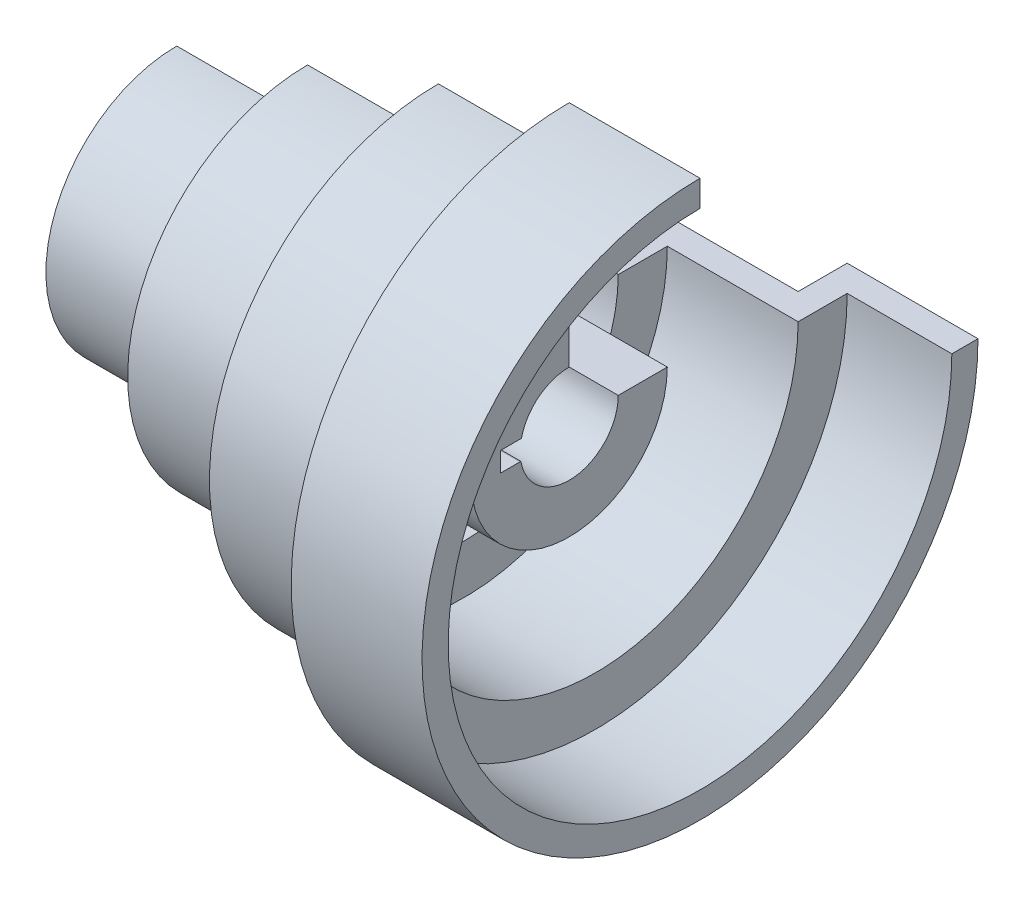
ISO-10303-21;
HEADER;
FILE_DESCRIPTION(('STEP AP214'),'2;1');
FILE_NAME('part.step','',(''),(''),'','','');
FILE_SCHEMA(('AUTOMOTIVE_DESIGN { 1 0 10303 214 1 1 1 1 }'));
ENDSEC;
DATA;
#1=APPLICATION_CONTEXT('core data for automotive mechanical design processes');
#2=APPLICATION_PROTOCOL_DEFINITION('international standard','automotive_design',2000,#1);
#3=PRODUCT_CONTEXT('',#1,'mechanical');
#4=PRODUCT('Part','Part','',(#3));
#5=PRODUCT_RELATED_PRODUCT_CATEGORY('part','',(#4));
#6=PRODUCT_DEFINITION_FORMATION('','',#4);
#7=PRODUCT_DEFINITION_CONTEXT('part definition',#1,'design');
#8=PRODUCT_DEFINITION('design','',#6,#7);
#9=PRODUCT_DEFINITION_SHAPE('','',#8);
#10=(LENGTH_UNIT() NAMED_UNIT(*) SI_UNIT(.MILLI.,.METRE.));
#11=(NAMED_UNIT(*) PLANE_ANGLE_UNIT() SI_UNIT($,.RADIAN.));
#12=(NAMED_UNIT(*) SI_UNIT($,.STERADIAN.) SOLID_ANGLE_UNIT());
#13=UNCERTAINTY_MEASURE_WITH_UNIT(LENGTH_MEASURE(1.E-05),#10,'distance_accuracy_value','');
#14=(GEOMETRIC_REPRESENTATION_CONTEXT(3) GLOBAL_UNCERTAINTY_ASSIGNED_CONTEXT((#13)) GLOBAL_UNIT_ASSIGNED_CONTEXT((#10,
#11,#12)) REPRESENTATION_CONTEXT('',''));
#15=CARTESIAN_POINT('',(0.,0.,0.));
#16=DIRECTION('',(0.,0.,1.));
#17=DIRECTION('',(1.,0.,0.));
#18=AXIS2_PLACEMENT_3D('',#15,#16,#17);
#19=CARTESIAN_POINT('',(-141.986286210627,1.57116660247941E-13,-15.));
#20=DIRECTION('',(1.,0.,0.));
#21=DIRECTION('',(0.,0.,-1.));
#22=AXIS2_PLACEMENT_3D('',#19,#20,#21);
#23=PLANE('',#22);
#24=DIRECTION('',(0.,0.,1.));
#25=VECTOR('',#24,1.);
#26=CARTESIAN_POINT('',(-141.986286210627,-2.59126506949967,15.));
#27=LINE('',#26,#25);
#28=CARTESIAN_POINT('',(-141.986286210627,-2.59126506949967,14.7744829127652));
#29=VERTEX_POINT('',#28);
#30=CARTESIAN_POINT('',(-141.986286210627,-2.59126506949967,15.));
#31=VERTEX_POINT('',#30);
#32=EDGE_CURVE('E207',#29,#31,#27,.T.);
#33=ORIENTED_EDGE('',*,*,#32,.F.);
#34=CARTESIAN_POINT('',(-141.986286210627,0.,0.));
#35=DIRECTION('',(-1.,0.,0.));
#36=DIRECTION('',(0.,0.,1.));
#37=AXIS2_PLACEMENT_3D('',#34,#35,#36);
#38=CIRCLE('',#37,15.);
#39=CARTESIAN_POINT('',(-141.986286210627,1.57116660247941E-13,-15.));
#40=VERTEX_POINT('',#39);
#41=EDGE_CURVE('E399',#40,#29,#38,.T.);
#42=ORIENTED_EDGE('',*,*,#41,.F.);
#43=DIRECTION('',(0.,0.,1.));
#44=VECTOR('',#43,1.);
#45=CARTESIAN_POINT('',(-141.986286210627,1.57116660247941E-13,-15.));
#46=LINE('',#45,#44);
#47=CARTESIAN_POINT('',(-141.986286210627,4.18977760661176E-13,-40.));
#48=VERTEX_POINT('',#47);
#49=EDGE_CURVE('E327',#48,#40,#46,.T.);
#50=ORIENTED_EDGE('',*,*,#49,.F.);
#51=CARTESIAN_POINT('',(-141.986286210627,0.,0.));
#52=DIRECTION('',(-1.,0.,0.));
#53=DIRECTION('',(0.,0.,1.));
#54=AXIS2_PLACEMENT_3D('',#51,#52,#53);
#55=CIRCLE('',#54,40.);
#56=CARTESIAN_POINT('',(-141.986286210627,40.,0.));
#57=VERTEX_POINT('',#56);
#58=EDGE_CURVE('E69',#48,#57,#55,.T.);
#59=ORIENTED_EDGE('',*,*,#58,.T.);
#60=DIRECTION('',(0.,-1.,0.));
#61=VECTOR('',#60,1.);
#62=CARTESIAN_POINT('',(-141.986286210627,15.,0.));
#63=LINE('',#62,#61);
#64=CARTESIAN_POINT('',(-141.986286210627,15.,0.));
#65=VERTEX_POINT('',#64);
#66=EDGE_CURVE('E256',#57,#65,#63,.T.);
#67=ORIENTED_EDGE('',*,*,#66,.T.);
#68=CARTESIAN_POINT('',(-141.986286210627,3.40873493050033,14.607550313916));
#69=VERTEX_POINT('',#68);
#70=EDGE_CURVE('E398',#69,#65,#38,.T.);
#71=ORIENTED_EDGE('',*,*,#70,.F.);
#72=DIRECTION('',(0.,0.,-1.));
#73=VECTOR('',#72,1.);
#74=CARTESIAN_POINT('',(-141.986286210627,3.40873493050033,15.));
#75=LINE('',#74,#73);
#76=CARTESIAN_POINT('',(-141.986286210627,3.40873493050033,15.));
#77=VERTEX_POINT('',#76);
#78=EDGE_CURVE('E238',#77,#69,#75,.T.);
#79=ORIENTED_EDGE('',*,*,#78,.F.);
#80=DIRECTION('',(0.,0.,-1.));
#81=VECTOR('',#80,1.);
#82=CARTESIAN_POINT('',(-141.986286210627,3.40873493050033,15.));
#83=LINE('',#82,#81);
#84=CARTESIAN_POINT('',(-141.986286210627,3.40873493050033,21.));
#85=VERTEX_POINT('',#84);
#86=EDGE_CURVE('E232',#85,#77,#83,.T.);
#87=ORIENTED_EDGE('',*,*,#86,.F.);
#88=DIRECTION('',(0.,1.,0.));
#89=VECTOR('',#88,1.);
#90=CARTESIAN_POINT('',(-141.986286210627,3.40873493050033,21.));
#91=LINE('',#90,#89);
#92=CARTESIAN_POINT('',(-141.986286210627,-2.59126506949967,21.));
#93=VERTEX_POINT('',#92);
#94=EDGE_CURVE('E228',#93,#85,#91,.T.);
#95=ORIENTED_EDGE('',*,*,#94,.F.);
#96=DIRECTION('',(0.,0.,1.));
#97=VECTOR('',#96,1.);
#98=CARTESIAN_POINT('',(-141.986286210627,-2.59126506949967,15.));
#99=LINE('',#98,#97);
#100=EDGE_CURVE('E216',#31,#93,#99,.T.);
#101=ORIENTED_EDGE('',*,*,#100,.F.);
#102=EDGE_LOOP('',(#33,#42,#50,#59,#67,#71,#79,#87,#95,#101));
#103=FACE_BOUND('',#102,.T.);
#104=ADVANCED_FACE('F45',(#103),#23,.F.);
#105=CARTESIAN_POINT('',(-141.986286210627,0.,0.));
#106=DIRECTION('',(-1.,0.,0.));
#107=DIRECTION('',(0.,0.,1.));
#108=AXIS2_PLACEMENT_3D('',#105,#106,#107);
#109=CYLINDRICAL_SURFACE('',#108,15.);
#110=DIRECTION('',(1.,0.,0.));
#111=VECTOR('',#110,1.);
#112=CARTESIAN_POINT('',(-502.974513165468,3.40873493050033,14.607550313916));
#113=LINE('',#112,#111);
#114=CARTESIAN_POINT('',(-21.9862862106269,3.40873493050033,14.607550313916));
#115=VERTEX_POINT('',#114);
#116=EDGE_CURVE('E241',#69,#115,#113,.T.);
#117=ORIENTED_EDGE('',*,*,#116,.F.);
#118=ORIENTED_EDGE('',*,*,#70,.T.);
#119=DIRECTION('',(1.,0.,0.));
#120=VECTOR('',#119,1.);
#121=CARTESIAN_POINT('',(-141.986286210627,15.,0.));
#122=LINE('',#121,#120);
#123=CARTESIAN_POINT('',(-21.9862862106269,15.,0.));
#124=VERTEX_POINT('',#123);
#125=EDGE_CURVE('E260',#65,#124,#122,.T.);
#126=ORIENTED_EDGE('',*,*,#125,.T.);
#127=CARTESIAN_POINT('',(-21.9862862106269,0.,0.));
#128=DIRECTION('',(-1.,0.,0.));
#129=DIRECTION('',(0.,0.,1.));
#130=AXIS2_PLACEMENT_3D('',#127,#128,#129);
#131=CIRCLE('',#130,15.);
#132=EDGE_CURVE('E402',#115,#124,#131,.T.);
#133=ORIENTED_EDGE('',*,*,#132,.F.);
#134=EDGE_LOOP('',(#117,#118,#126,#133));
#135=FACE_BOUND('',#134,.T.);
#136=ADVANCED_FACE('F477',(#135),#109,.F.);
#137=CARTESIAN_POINT('',(-141.986286210627,0.,0.));
#138=DIRECTION('',(-1.,0.,0.));
#139=DIRECTION('',(0.,0.,1.));
#140=AXIS2_PLACEMENT_3D('',#137,#138,#139);
#141=CYLINDRICAL_SURFACE('',#140,40.);
#142=CARTESIAN_POINT('',(-101.986286210627,0.,0.));
#143=DIRECTION('',(-1.,0.,0.));
#144=DIRECTION('',(0.,0.,1.));
#145=AXIS2_PLACEMENT_3D('',#142,#143,#144);
#146=CIRCLE('',#145,40.);
#147=CARTESIAN_POINT('',(-101.986286210627,4.18977760661176E-13,-40.));
#148=VERTEX_POINT('',#147);
#149=CARTESIAN_POINT('',(-101.986286210627,40.,0.));
#150=VERTEX_POINT('',#149);
#151=EDGE_CURVE('E449',#148,#150,#146,.T.);
#152=ORIENTED_EDGE('',*,*,#151,.T.);
#153=DIRECTION('',(-1.,0.,0.));
#154=VECTOR('',#153,1.);
#155=CARTESIAN_POINT('',(-141.986286210627,40.,0.));
#156=LINE('',#155,#154);
#157=EDGE_CURVE('E324',#150,#57,#156,.T.);
#158=ORIENTED_EDGE('',*,*,#157,.T.);
#159=ORIENTED_EDGE('',*,*,#58,.F.);
#160=DIRECTION('',(-1.,0.,0.));
#161=VECTOR('',#160,1.);
#162=CARTESIAN_POINT('',(-141.986286210627,4.18977760661176E-13,-40.));
#163=LINE('',#162,#161);
#164=EDGE_CURVE('E395',#148,#48,#163,.T.);
#165=ORIENTED_EDGE('',*,*,#164,.F.);
#166=EDGE_LOOP('',(#152,#158,#159,#165));
#167=FACE_BOUND('',#166,.T.);
#168=ADVANCED_FACE('F47',(#167),#141,.T.);
#169=CARTESIAN_POINT('',(-101.986286210627,5.76094420909117E-13,-55.));
#170=DIRECTION('',(1.,0.,0.));
#171=DIRECTION('',(0.,0.,-1.));
#172=AXIS2_PLACEMENT_3D('',#169,#170,#171);
#173=PLANE('',#172);
#174=CARTESIAN_POINT('',(-101.986286210627,0.,0.));
#175=DIRECTION('',(-1.,0.,0.));
#176=DIRECTION('',(0.,0.,1.));
#177=AXIS2_PLACEMENT_3D('',#174,#175,#176);
#178=CIRCLE('',#177,55.);
#179=CARTESIAN_POINT('',(-101.986286210627,5.76094420909117E-13,-55.));
#180=VERTEX_POINT('',#179);
#181=CARTESIAN_POINT('',(-101.986286210627,55.,0.));
#182=VERTEX_POINT('',#181);
#183=EDGE_CURVE('E446',#180,#182,#178,.T.);
#184=ORIENTED_EDGE('',*,*,#183,.T.);
#185=DIRECTION('',(0.,-1.,0.));
#186=VECTOR('',#185,1.);
#187=CARTESIAN_POINT('',(-101.986286210627,55.,0.));
#188=LINE('',#187,#186);
#189=EDGE_CURVE('E320',#182,#150,#188,.T.);
#190=ORIENTED_EDGE('',*,*,#189,.T.);
#191=ORIENTED_EDGE('',*,*,#151,.F.);
#192=DIRECTION('',(0.,0.,1.));
#193=VECTOR('',#192,1.);
#194=CARTESIAN_POINT('',(-101.986286210627,5.76094420909117E-13,-55.));
#195=LINE('',#194,#193);
#196=EDGE_CURVE('E391',#180,#148,#195,.T.);
#197=ORIENTED_EDGE('',*,*,#196,.F.);
#198=EDGE_LOOP('',(#184,#190,#191,#197));
#199=FACE_BOUND('',#198,.T.);
#200=ADVANCED_FACE('F493',(#199),#173,.F.);
#201=CARTESIAN_POINT('',(-141.986286210627,0.,0.));
#202=DIRECTION('',(-1.,0.,0.));
#203=DIRECTION('',(0.,0.,1.));
#204=AXIS2_PLACEMENT_3D('',#201,#202,#203);
#205=CYLINDRICAL_SURFACE('',#204,55.);
#206=CARTESIAN_POINT('',(-61.9862862106269,0.,0.));
#207=DIRECTION('',(-1.,0.,0.));
#208=DIRECTION('',(0.,0.,1.));
#209=AXIS2_PLACEMENT_3D('',#206,#207,#208);
#210=CIRCLE('',#209,55.);
#211=CARTESIAN_POINT('',(-61.9862862106269,5.76094420909117E-13,-55.));
#212=VERTEX_POINT('',#211);
#213=CARTESIAN_POINT('',(-61.9862862106269,55.,0.));
#214=VERTEX_POINT('',#213);
#215=EDGE_CURVE('E443',#212,#214,#210,.T.);
#216=ORIENTED_EDGE('',*,*,#215,.T.);
#217=DIRECTION('',(-1.,0.,0.));
#218=VECTOR('',#217,1.);
#219=CARTESIAN_POINT('',(-101.986286210627,55.,0.));
#220=LINE('',#219,#218);
#221=EDGE_CURVE('E316',#214,#182,#220,.T.);
#222=ORIENTED_EDGE('',*,*,#221,.T.);
#223=ORIENTED_EDGE('',*,*,#183,.F.);
#224=DIRECTION('',(-1.,0.,0.));
#225=VECTOR('',#224,1.);
#226=CARTESIAN_POINT('',(-101.986286210627,5.76094420909117E-13,-55.));
#227=LINE('',#226,#225);
#228=EDGE_CURVE('E387',#212,#180,#227,.T.);
#229=ORIENTED_EDGE('',*,*,#228,.F.);
#230=EDGE_LOOP('',(#216,#222,#223,#229));
#231=FACE_BOUND('',#230,.T.);
#232=ADVANCED_FACE('F497',(#231),#205,.T.);
#233=CARTESIAN_POINT('',(-61.9862862106269,5.76094420909117E-13,-55.));
#234=DIRECTION('',(1.,0.,0.));
#235=DIRECTION('',(0.,0.,-1.));
#236=AXIS2_PLACEMENT_3D('',#233,#234,#235);
#237=PLANE('',#236);
#238=CARTESIAN_POINT('',(-61.9862862106269,0.,0.));
#239=DIRECTION('',(-1.,0.,0.));
#240=DIRECTION('',(0.,0.,1.));
#241=AXIS2_PLACEMENT_3D('',#238,#239,#240);
#242=CIRCLE('',#241,70.);
#243=CARTESIAN_POINT('',(-61.9862862106269,7.33211081157058E-13,-70.));
#244=VERTEX_POINT('',#243);
#245=CARTESIAN_POINT('',(-61.9862862106269,70.,0.));
#246=VERTEX_POINT('',#245);
#247=EDGE_CURVE('E440',#244,#246,#242,.T.);
#248=ORIENTED_EDGE('',*,*,#247,.T.);
#249=DIRECTION('',(0.,-1.,0.));
#250=VECTOR('',#249,1.);
#251=CARTESIAN_POINT('',(-61.9862862106269,55.,0.));
#252=LINE('',#251,#250);
#253=EDGE_CURVE('E312',#246,#214,#252,.T.);
#254=ORIENTED_EDGE('',*,*,#253,.T.);
#255=ORIENTED_EDGE('',*,*,#215,.F.);
#256=DIRECTION('',(0.,0.,1.));
#257=VECTOR('',#256,1.);
#258=CARTESIAN_POINT('',(-61.9862862106269,5.76094420909117E-13,-55.));
#259=LINE('',#258,#257);
#260=EDGE_CURVE('E383',#244,#212,#259,.T.);
#261=ORIENTED_EDGE('',*,*,#260,.F.);
#262=EDGE_LOOP('',(#248,#254,#255,#261));
#263=FACE_BOUND('',#262,.T.);
#264=ADVANCED_FACE('F500',(#263),#237,.F.);
#265=CARTESIAN_POINT('',(-141.986286210627,0.,0.));
#266=DIRECTION('',(-1.,0.,0.));
#267=DIRECTION('',(0.,0.,1.));
#268=AXIS2_PLACEMENT_3D('',#265,#266,#267);
#269=CYLINDRICAL_SURFACE('',#268,70.);
#270=CARTESIAN_POINT('',(-21.9862862106269,0.,0.));
#271=DIRECTION('',(-1.,0.,0.));
#272=DIRECTION('',(0.,0.,1.));
#273=AXIS2_PLACEMENT_3D('',#270,#271,#272);
#274=CIRCLE('',#273,70.);
#275=CARTESIAN_POINT('',(-21.9862862106269,7.33211081157058E-13,-70.));
#276=VERTEX_POINT('',#275);
#277=CARTESIAN_POINT('',(-21.9862862106269,70.,0.));
#278=VERTEX_POINT('',#277);
#279=EDGE_CURVE('E437',#276,#278,#274,.T.);
#280=ORIENTED_EDGE('',*,*,#279,.T.);
#281=DIRECTION('',(-1.,0.,0.));
#282=VECTOR('',#281,1.);
#283=CARTESIAN_POINT('',(-61.9862862106269,70.,0.));
#284=LINE('',#283,#282);
#285=EDGE_CURVE('E308',#278,#246,#284,.T.);
#286=ORIENTED_EDGE('',*,*,#285,.T.);
#287=ORIENTED_EDGE('',*,*,#247,.F.);
#288=DIRECTION('',(-1.,0.,0.));
#289=VECTOR('',#288,1.);
#290=CARTESIAN_POINT('',(-61.9862862106269,7.33211081157058E-13,-70.));
#291=LINE('',#290,#289);
#292=EDGE_CURVE('E379',#276,#244,#291,.T.);
#293=ORIENTED_EDGE('',*,*,#292,.F.);
#294=EDGE_LOOP('',(#280,#286,#287,#293));
#295=FACE_BOUND('',#294,.T.);
#296=ADVANCED_FACE('F505',(#295),#269,.T.);
#297=CARTESIAN_POINT('',(-21.9862862106269,7.33211081157058E-13,-70.));
#298=DIRECTION('',(1.,0.,0.));
#299=DIRECTION('',(0.,0.,-1.));
#300=AXIS2_PLACEMENT_3D('',#297,#298,#299);
#301=PLANE('',#300);
#302=CARTESIAN_POINT('',(-21.9862862106269,0.,0.));
#303=DIRECTION('',(-1.,0.,0.));
#304=DIRECTION('',(0.,0.,1.));
#305=AXIS2_PLACEMENT_3D('',#302,#303,#304);
#306=CIRCLE('',#305,85.);
#307=CARTESIAN_POINT('',(-21.9862862106269,8.90327741404999E-13,-85.));
#308=VERTEX_POINT('',#307);
#309=CARTESIAN_POINT('',(-21.9862862106269,85.,0.));
#310=VERTEX_POINT('',#309);
#311=EDGE_CURVE('E434',#308,#310,#306,.T.);
#312=ORIENTED_EDGE('',*,*,#311,.T.);
#313=DIRECTION('',(0.,-1.,0.));
#314=VECTOR('',#313,1.);
#315=CARTESIAN_POINT('',(-21.9862862106269,70.,0.));
#316=LINE('',#315,#314);
#317=EDGE_CURVE('E304',#310,#278,#316,.T.);
#318=ORIENTED_EDGE('',*,*,#317,.T.);
#319=ORIENTED_EDGE('',*,*,#279,.F.);
#320=DIRECTION('',(0.,0.,1.));
#321=VECTOR('',#320,1.);
#322=CARTESIAN_POINT('',(-21.9862862106269,7.33211081157058E-13,-70.));
#323=LINE('',#322,#321);
#324=EDGE_CURVE('E375',#308,#276,#323,.T.);
#325=ORIENTED_EDGE('',*,*,#324,.F.);
#326=EDGE_LOOP('',(#312,#318,#319,#325));
#327=FACE_BOUND('',#326,.T.);
#328=ADVANCED_FACE('F509',(#327),#301,.F.);
#329=CARTESIAN_POINT('',(-141.986286210627,0.,0.));
#330=DIRECTION('',(-1.,0.,0.));
#331=DIRECTION('',(0.,0.,1.));
#332=AXIS2_PLACEMENT_3D('',#329,#330,#331);
#333=CYLINDRICAL_SURFACE('',#332,85.);
#334=CARTESIAN_POINT('',(18.0137137893731,0.,0.));
#335=DIRECTION('',(-1.,0.,0.));
#336=DIRECTION('',(0.,0.,1.));
#337=AXIS2_PLACEMENT_3D('',#334,#335,#336);
#338=CIRCLE('',#337,85.);
#339=CARTESIAN_POINT('',(18.0137137893731,8.90327741404999E-13,-85.));
#340=VERTEX_POINT('',#339);
#341=CARTESIAN_POINT('',(18.0137137893731,85.,0.));
#342=VERTEX_POINT('',#341);
#343=EDGE_CURVE('E431',#340,#342,#338,.T.);
#344=ORIENTED_EDGE('',*,*,#343,.T.);
#345=DIRECTION('',(-1.,0.,0.));
#346=VECTOR('',#345,1.);
#347=CARTESIAN_POINT('',(-21.9862862106269,85.,0.));
#348=LINE('',#347,#346);
#349=EDGE_CURVE('E300',#342,#310,#348,.T.);
#350=ORIENTED_EDGE('',*,*,#349,.T.);
#351=ORIENTED_EDGE('',*,*,#311,.F.);
#352=DIRECTION('',(-1.,0.,0.));
#353=VECTOR('',#352,1.);
#354=CARTESIAN_POINT('',(-21.9862862106269,8.90327741404999E-13,-85.));
#355=LINE('',#354,#353);
#356=EDGE_CURVE('E371',#340,#308,#355,.T.);
#357=ORIENTED_EDGE('',*,*,#356,.F.);
#358=EDGE_LOOP('',(#344,#350,#351,#357));
#359=FACE_BOUND('',#358,.T.);
#360=ADVANCED_FACE('F512',(#359),#333,.T.);
#361=CARTESIAN_POINT('',(18.0137137893731,8.06532189272764E-13,-77.));
#362=DIRECTION('',(-1.,0.,0.));
#363=DIRECTION('',(0.,0.,1.));
#364=AXIS2_PLACEMENT_3D('',#361,#362,#363);
#365=PLANE('',#364);
#366=CARTESIAN_POINT('',(18.0137137893731,0.,0.));
#367=DIRECTION('',(-1.,0.,0.));
#368=DIRECTION('',(0.,0.,1.));
#369=AXIS2_PLACEMENT_3D('',#366,#367,#368);
#370=CIRCLE('',#369,77.);
#371=CARTESIAN_POINT('',(18.0137137893731,8.06532189272764E-13,-77.));
#372=VERTEX_POINT('',#371);
#373=CARTESIAN_POINT('',(18.0137137893731,77.,0.));
#374=VERTEX_POINT('',#373);
#375=EDGE_CURVE('E428',#372,#374,#370,.T.);
#376=ORIENTED_EDGE('',*,*,#375,.T.);
#377=DIRECTION('',(0.,1.,0.));
#378=VECTOR('',#377,1.);
#379=CARTESIAN_POINT('',(18.0137137893731,77.,0.));
#380=LINE('',#379,#378);
#381=EDGE_CURVE('E296',#374,#342,#380,.T.);
#382=ORIENTED_EDGE('',*,*,#381,.T.);
#383=ORIENTED_EDGE('',*,*,#343,.F.);
#384=DIRECTION('',(0.,0.,-1.));
#385=VECTOR('',#384,1.);
#386=CARTESIAN_POINT('',(18.0137137893731,8.06532189272764E-13,-77.));
#387=LINE('',#386,#385);
#388=EDGE_CURVE('E367',#372,#340,#387,.T.);
#389=ORIENTED_EDGE('',*,*,#388,.F.);
#390=EDGE_LOOP('',(#376,#382,#383,#389));
#391=FACE_BOUND('',#390,.T.);
#392=ADVANCED_FACE('F517',(#391),#365,.F.);
#393=CARTESIAN_POINT('',(-141.986286210627,0.,0.));
#394=DIRECTION('',(-1.,0.,0.));
#395=DIRECTION('',(0.,0.,1.));
#396=AXIS2_PLACEMENT_3D('',#393,#394,#395);
#397=CYLINDRICAL_SURFACE('',#396,77.);
#398=CARTESIAN_POINT('',(-13.9862862106269,0.,0.));
#399=DIRECTION('',(-1.,0.,0.));
#400=DIRECTION('',(0.,0.,1.));
#401=AXIS2_PLACEMENT_3D('',#398,#399,#400);
#402=CIRCLE('',#401,77.);
#403=CARTESIAN_POINT('',(-13.9862862106269,8.06532189272764E-13,-77.));
#404=VERTEX_POINT('',#403);
#405=CARTESIAN_POINT('',(-13.9862862106269,77.,0.));
#406=VERTEX_POINT('',#405);
#407=EDGE_CURVE('E425',#404,#406,#402,.T.);
#408=ORIENTED_EDGE('',*,*,#407,.T.);
#409=DIRECTION('',(1.,0.,0.));
#410=VECTOR('',#409,1.);
#411=CARTESIAN_POINT('',(-13.9862862106269,77.,0.));
#412=LINE('',#411,#410);
#413=EDGE_CURVE('E292',#406,#374,#412,.T.);
#414=ORIENTED_EDGE('',*,*,#413,.T.);
#415=ORIENTED_EDGE('',*,*,#375,.F.);
#416=DIRECTION('',(1.,0.,0.));
#417=VECTOR('',#416,1.);
#418=CARTESIAN_POINT('',(-13.9862862106269,8.06532189272764E-13,-77.));
#419=LINE('',#418,#417);
#420=EDGE_CURVE('E363',#404,#372,#419,.T.);
#421=ORIENTED_EDGE('',*,*,#420,.F.);
#422=EDGE_LOOP('',(#408,#414,#415,#421));
#423=FACE_BOUND('',#422,.T.);
#424=ADVANCED_FACE('F521',(#423),#397,.F.);
#425=CARTESIAN_POINT('',(-13.9862862106269,6.49415529024823E-13,-62.));
#426=DIRECTION('',(-1.,0.,0.));
#427=DIRECTION('',(0.,0.,1.));
#428=AXIS2_PLACEMENT_3D('',#425,#426,#427);
#429=PLANE('',#428);
#430=CARTESIAN_POINT('',(-13.9862862106269,0.,0.));
#431=DIRECTION('',(-1.,0.,0.));
#432=DIRECTION('',(0.,0.,1.));
#433=AXIS2_PLACEMENT_3D('',#430,#431,#432);
#434=CIRCLE('',#433,62.);
#435=CARTESIAN_POINT('',(-13.9862862106269,6.49415529024823E-13,-62.));
#436=VERTEX_POINT('',#435);
#437=CARTESIAN_POINT('',(-13.9862862106269,62.,0.));
#438=VERTEX_POINT('',#437);
#439=EDGE_CURVE('E422',#436,#438,#434,.T.);
#440=ORIENTED_EDGE('',*,*,#439,.T.);
#441=DIRECTION('',(0.,1.,0.));
#442=VECTOR('',#441,1.);
#443=CARTESIAN_POINT('',(-13.9862862106269,62.,0.));
#444=LINE('',#443,#442);
#445=EDGE_CURVE('E288',#438,#406,#444,.T.);
#446=ORIENTED_EDGE('',*,*,#445,.T.);
#447=ORIENTED_EDGE('',*,*,#407,.F.);
#448=DIRECTION('',(0.,0.,-1.));
#449=VECTOR('',#448,1.);
#450=CARTESIAN_POINT('',(-13.9862862106269,6.49415529024823E-13,-62.));
#451=LINE('',#450,#449);
#452=EDGE_CURVE('E359',#436,#404,#451,.T.);
#453=ORIENTED_EDGE('',*,*,#452,.F.);
#454=EDGE_LOOP('',(#440,#446,#447,#453));
#455=FACE_BOUND('',#454,.T.);
#456=ADVANCED_FACE('F524',(#455),#429,.F.);
#457=CARTESIAN_POINT('',(-141.986286210627,0.,0.));
#458=DIRECTION('',(-1.,0.,0.));
#459=DIRECTION('',(0.,0.,1.));
#460=AXIS2_PLACEMENT_3D('',#457,#458,#459);
#461=CYLINDRICAL_SURFACE('',#460,62.);
#462=CARTESIAN_POINT('',(-53.9862862106269,0.,0.));
#463=DIRECTION('',(-1.,0.,0.));
#464=DIRECTION('',(0.,0.,1.));
#465=AXIS2_PLACEMENT_3D('',#462,#463,#464);
#466=CIRCLE('',#465,62.);
#467=CARTESIAN_POINT('',(-53.9862862106269,6.49415529024823E-13,-62.));
#468=VERTEX_POINT('',#467);
#469=CARTESIAN_POINT('',(-53.9862862106269,62.,0.));
#470=VERTEX_POINT('',#469);
#471=EDGE_CURVE('E419',#468,#470,#466,.T.);
#472=ORIENTED_EDGE('',*,*,#471,.T.);
#473=DIRECTION('',(1.,0.,0.));
#474=VECTOR('',#473,1.);
#475=CARTESIAN_POINT('',(-53.9862862106269,62.,0.));
#476=LINE('',#475,#474);
#477=EDGE_CURVE('E284',#470,#438,#476,.T.);
#478=ORIENTED_EDGE('',*,*,#477,.T.);
#479=ORIENTED_EDGE('',*,*,#439,.F.);
#480=DIRECTION('',(1.,0.,0.));
#481=VECTOR('',#480,1.);
#482=CARTESIAN_POINT('',(-53.9862862106269,6.49415529024823E-13,-62.));
#483=LINE('',#482,#481);
#484=EDGE_CURVE('E355',#468,#436,#483,.T.);
#485=ORIENTED_EDGE('',*,*,#484,.F.);
#486=EDGE_LOOP('',(#472,#478,#479,#485));
#487=FACE_BOUND('',#486,.T.);
#488=ADVANCED_FACE('F529',(#487),#461,.F.);
#489=CARTESIAN_POINT('',(-53.9862862106269,6.49415529024823E-13,-62.));
#490=DIRECTION('',(-1.,0.,0.));
#491=DIRECTION('',(0.,0.,1.));
#492=AXIS2_PLACEMENT_3D('',#489,#490,#491);
#493=PLANE('',#492);
#494=CARTESIAN_POINT('',(-53.9862862106269,0.,0.));
#495=DIRECTION('',(-1.,0.,0.));
#496=DIRECTION('',(0.,0.,1.));
#497=AXIS2_PLACEMENT_3D('',#494,#495,#496);
#498=CIRCLE('',#497,47.);
#499=CARTESIAN_POINT('',(-53.9862862106269,4.92298868776882E-13,-47.));
#500=VERTEX_POINT('',#499);
#501=CARTESIAN_POINT('',(-53.9862862106269,47.,0.));
#502=VERTEX_POINT('',#501);
#503=EDGE_CURVE('E416',#500,#502,#498,.T.);
#504=ORIENTED_EDGE('',*,*,#503,.T.);
#505=DIRECTION('',(0.,1.,0.));
#506=VECTOR('',#505,1.);
#507=CARTESIAN_POINT('',(-53.9862862106269,62.,0.));
#508=LINE('',#507,#506);
#509=EDGE_CURVE('E280',#502,#470,#508,.T.);
#510=ORIENTED_EDGE('',*,*,#509,.T.);
#511=ORIENTED_EDGE('',*,*,#471,.F.);
#512=DIRECTION('',(0.,0.,-1.));
#513=VECTOR('',#512,1.);
#514=CARTESIAN_POINT('',(-53.9862862106269,6.49415529024823E-13,-62.));
#515=LINE('',#514,#513);
#516=EDGE_CURVE('E351',#500,#468,#515,.T.);
#517=ORIENTED_EDGE('',*,*,#516,.F.);
#518=EDGE_LOOP('',(#504,#510,#511,#517));
#519=FACE_BOUND('',#518,.T.);
#520=ADVANCED_FACE('F533',(#519),#493,.F.);
#521=CARTESIAN_POINT('',(-141.986286210627,0.,0.));
#522=DIRECTION('',(-1.,0.,0.));
#523=DIRECTION('',(0.,0.,1.));
#524=AXIS2_PLACEMENT_3D('',#521,#522,#523);
#525=CYLINDRICAL_SURFACE('',#524,47.);
#526=CARTESIAN_POINT('',(-93.9862862106269,0.,0.));
#527=DIRECTION('',(-1.,0.,0.));
#528=DIRECTION('',(0.,0.,1.));
#529=AXIS2_PLACEMENT_3D('',#526,#527,#528);
#530=CIRCLE('',#529,47.);
#531=CARTESIAN_POINT('',(-93.9862862106269,4.92298868776882E-13,-47.));
#532=VERTEX_POINT('',#531);
#533=CARTESIAN_POINT('',(-93.9862862106269,47.,0.));
#534=VERTEX_POINT('',#533);
#535=EDGE_CURVE('E413',#532,#534,#530,.T.);
#536=ORIENTED_EDGE('',*,*,#535,.T.);
#537=DIRECTION('',(1.,0.,0.));
#538=VECTOR('',#537,1.);
#539=CARTESIAN_POINT('',(-93.9862862106269,47.,0.));
#540=LINE('',#539,#538);
#541=EDGE_CURVE('E276',#534,#502,#540,.T.);
#542=ORIENTED_EDGE('',*,*,#541,.T.);
#543=ORIENTED_EDGE('',*,*,#503,.F.);
#544=DIRECTION('',(1.,0.,0.));
#545=VECTOR('',#544,1.);
#546=CARTESIAN_POINT('',(-93.9862862106269,4.92298868776882E-13,-47.));
#547=LINE('',#546,#545);
#548=EDGE_CURVE('E347',#532,#500,#547,.T.);
#549=ORIENTED_EDGE('',*,*,#548,.F.);
#550=EDGE_LOOP('',(#536,#542,#543,#549));
#551=FACE_BOUND('',#550,.T.);
#552=ADVANCED_FACE('F536',(#551),#525,.F.);
#553=CARTESIAN_POINT('',(-93.9862862106269,3.14233320495882E-13,-30.));
#554=DIRECTION('',(-1.,0.,0.));
#555=DIRECTION('',(0.,0.,1.));
#556=AXIS2_PLACEMENT_3D('',#553,#554,#555);
#557=PLANE('',#556);
#558=CARTESIAN_POINT('',(-93.9862862106269,0.,0.));
#559=DIRECTION('',(-1.,0.,0.));
#560=DIRECTION('',(0.,0.,1.));
#561=AXIS2_PLACEMENT_3D('',#558,#559,#560);
#562=CIRCLE('',#561,30.);
#563=CARTESIAN_POINT('',(-93.9862862106269,3.14233320495882E-13,-30.));
#564=VERTEX_POINT('',#563);
#565=CARTESIAN_POINT('',(-93.9862862106269,30.,0.));
#566=VERTEX_POINT('',#565);
#567=EDGE_CURVE('E410',#564,#566,#562,.T.);
#568=ORIENTED_EDGE('',*,*,#567,.T.);
#569=DIRECTION('',(0.,1.,0.));
#570=VECTOR('',#569,1.);
#571=CARTESIAN_POINT('',(-93.9862862106269,30.,0.));
#572=LINE('',#571,#570);
#573=EDGE_CURVE('E272',#566,#534,#572,.T.);
#574=ORIENTED_EDGE('',*,*,#573,.T.);
#575=ORIENTED_EDGE('',*,*,#535,.F.);
#576=DIRECTION('',(0.,0.,-1.));
#577=VECTOR('',#576,1.);
#578=CARTESIAN_POINT('',(-93.9862862106269,3.14233320495882E-13,-30.));
#579=LINE('',#578,#577);
#580=EDGE_CURVE('E343',#564,#532,#579,.T.);
#581=ORIENTED_EDGE('',*,*,#580,.F.);
#582=EDGE_LOOP('',(#568,#574,#575,#581));
#583=FACE_BOUND('',#582,.T.);
#584=ADVANCED_FACE('F539',(#583),#557,.F.);
#585=CARTESIAN_POINT('',(-141.986286210627,0.,0.));
#586=DIRECTION('',(-1.,0.,0.));
#587=DIRECTION('',(0.,0.,1.));
#588=AXIS2_PLACEMENT_3D('',#585,#586,#587);
#589=CYLINDRICAL_SURFACE('',#588,30.);
#590=CARTESIAN_POINT('',(-21.9862862106269,0.,0.));
#591=DIRECTION('',(-1.,0.,0.));
#592=DIRECTION('',(0.,0.,1.));
#593=AXIS2_PLACEMENT_3D('',#590,#591,#592);
#594=CIRCLE('',#593,30.);
#595=CARTESIAN_POINT('',(-21.9862862106269,3.14233320495882E-13,-30.));
#596=VERTEX_POINT('',#595);
#597=CARTESIAN_POINT('',(-21.9862862106269,30.,0.));
#598=VERTEX_POINT('',#597);
#599=EDGE_CURVE('E407',#596,#598,#594,.T.);
#600=ORIENTED_EDGE('',*,*,#599,.T.);
#601=DIRECTION('',(-1.,0.,0.));
#602=VECTOR('',#601,1.);
#603=CARTESIAN_POINT('',(-93.9862862106269,30.,0.));
#604=LINE('',#603,#602);
#605=EDGE_CURVE('E268',#598,#566,#604,.T.);
#606=ORIENTED_EDGE('',*,*,#605,.T.);
#607=ORIENTED_EDGE('',*,*,#567,.F.);
#608=DIRECTION('',(-1.,0.,0.));
#609=VECTOR('',#608,1.);
#610=CARTESIAN_POINT('',(-93.9862862106269,3.14233320495882E-13,-30.));
#611=LINE('',#610,#609);
#612=EDGE_CURVE('E339',#596,#564,#611,.T.);
#613=ORIENTED_EDGE('',*,*,#612,.F.);
#614=EDGE_LOOP('',(#600,#606,#607,#613));
#615=FACE_BOUND('',#614,.T.);
#616=ADVANCED_FACE('F543',(#615),#589,.T.);
#617=CARTESIAN_POINT('',(-21.9862862106269,1.57116660247941E-13,-15.));
#618=DIRECTION('',(-1.,0.,0.));
#619=DIRECTION('',(0.,0.,1.));
#620=AXIS2_PLACEMENT_3D('',#617,#618,#619);
#621=PLANE('',#620);
#622=CARTESIAN_POINT('',(-21.9862862106269,1.57116660247941E-13,-15.));
#623=VERTEX_POINT('',#622);
#624=CARTESIAN_POINT('',(-21.9862862106269,-2.59126506949967,14.7744829127652));
#625=VERTEX_POINT('',#624);
#626=EDGE_CURVE('E403',#623,#625,#131,.T.);
#627=ORIENTED_EDGE('',*,*,#626,.T.);
#628=DIRECTION('',(0.,0.,1.));
#629=VECTOR('',#628,1.);
#630=CARTESIAN_POINT('',(-21.9862862106269,-2.59126506949967,-15.));
#631=LINE('',#630,#629);
#632=CARTESIAN_POINT('',(-21.9862862106269,-2.59126506949967,15.));
#633=VERTEX_POINT('',#632);
#634=EDGE_CURVE('E61',#625,#633,#631,.T.);
#635=ORIENTED_EDGE('',*,*,#634,.T.);
#636=DIRECTION('',(0.,0.,1.));
#637=VECTOR('',#636,1.);
#638=CARTESIAN_POINT('',(-21.9862862106269,-2.59126506949967,-15.));
#639=LINE('',#638,#637);
#640=CARTESIAN_POINT('',(-21.9862862106269,-2.59126506949967,21.));
#641=VERTEX_POINT('',#640);
#642=EDGE_CURVE('E11',#633,#641,#639,.T.);
#643=ORIENTED_EDGE('',*,*,#642,.T.);
#644=DIRECTION('',(0.,1.,0.));
#645=VECTOR('',#644,1.);
#646=CARTESIAN_POINT('',(-21.9862862106269,1.57116660247941E-13,21.));
#647=LINE('',#646,#645);
#648=CARTESIAN_POINT('',(-21.9862862106269,3.40873493050033,21.));
#649=VERTEX_POINT('',#648);
#650=EDGE_CURVE('E54',#641,#649,#647,.T.);
#651=ORIENTED_EDGE('',*,*,#650,.T.);
#652=DIRECTION('',(0.,0.,-1.));
#653=VECTOR('',#652,1.);
#654=CARTESIAN_POINT('',(-21.9862862106269,3.40873493050033,-15.));
#655=LINE('',#654,#653);
#656=CARTESIAN_POINT('',(-21.9862862106269,3.40873493050033,15.));
#657=VERTEX_POINT('',#656);
#658=EDGE_CURVE('E460',#649,#657,#655,.T.);
#659=ORIENTED_EDGE('',*,*,#658,.T.);
#660=DIRECTION('',(0.,0.,-1.));
#661=VECTOR('',#660,1.);
#662=CARTESIAN_POINT('',(-21.9862862106269,3.40873493050033,-15.));
#663=LINE('',#662,#661);
#664=EDGE_CURVE('E456',#657,#115,#663,.T.);
#665=ORIENTED_EDGE('',*,*,#664,.T.);
#666=ORIENTED_EDGE('',*,*,#132,.T.);
#667=DIRECTION('',(0.,1.,0.));
#668=VECTOR('',#667,1.);
#669=CARTESIAN_POINT('',(-21.9862862106269,15.,0.));
#670=LINE('',#669,#668);
#671=EDGE_CURVE('E264',#124,#598,#670,.T.);
#672=ORIENTED_EDGE('',*,*,#671,.T.);
#673=ORIENTED_EDGE('',*,*,#599,.F.);
#674=DIRECTION('',(0.,0.,-1.));
#675=VECTOR('',#674,1.);
#676=CARTESIAN_POINT('',(-21.9862862106269,1.57116660247941E-13,-15.));
#677=LINE('',#676,#675);
#678=EDGE_CURVE('E335',#623,#596,#677,.T.);
#679=ORIENTED_EDGE('',*,*,#678,.F.);
#680=EDGE_LOOP('',(#627,#635,#643,#651,#659,#665,#666,#672,#673,#679));
#681=FACE_BOUND('',#680,.T.);
#682=ADVANCED_FACE('F466',(#681),#621,.F.);
#683=ORIENTED_EDGE('',*,*,#41,.T.);
#684=DIRECTION('',(-1.,0.,0.));
#685=VECTOR('',#684,1.);
#686=CARTESIAN_POINT('',(-141.986286210627,-2.59126506949967,14.7744829127652));
#687=LINE('',#686,#685);
#688=EDGE_CURVE('E211',#29,#625,#687,.F.);
#689=ORIENTED_EDGE('',*,*,#688,.T.);
#690=ORIENTED_EDGE('',*,*,#626,.F.);
#691=DIRECTION('',(1.,0.,0.));
#692=VECTOR('',#691,1.);
#693=CARTESIAN_POINT('',(-141.986286210627,1.57116660247941E-13,-15.));
#694=LINE('',#693,#692);
#695=EDGE_CURVE('E331',#40,#623,#694,.T.);
#696=ORIENTED_EDGE('',*,*,#695,.F.);
#697=EDGE_LOOP('',(#683,#689,#690,#696));
#698=FACE_BOUND('',#697,.T.);
#699=ADVANCED_FACE('F549',(#698),#109,.F.);
#700=CARTESIAN_POINT('',(0.,0.,0.));
#701=DIRECTION('',(0.,-1.,0.));
#702=DIRECTION('',(-1.,0.,0.));
#703=AXIS2_PLACEMENT_3D('',#700,#701,#702);
#704=PLANE('',#703);
#705=ORIENTED_EDGE('',*,*,#49,.T.);
#706=ORIENTED_EDGE('',*,*,#695,.T.);
#707=ORIENTED_EDGE('',*,*,#678,.T.);
#708=ORIENTED_EDGE('',*,*,#612,.T.);
#709=ORIENTED_EDGE('',*,*,#580,.T.);
#710=ORIENTED_EDGE('',*,*,#548,.T.);
#711=ORIENTED_EDGE('',*,*,#516,.T.);
#712=ORIENTED_EDGE('',*,*,#484,.T.);
#713=ORIENTED_EDGE('',*,*,#452,.T.);
#714=ORIENTED_EDGE('',*,*,#420,.T.);
#715=ORIENTED_EDGE('',*,*,#388,.T.);
#716=ORIENTED_EDGE('',*,*,#356,.T.);
#717=ORIENTED_EDGE('',*,*,#324,.T.);
#718=ORIENTED_EDGE('',*,*,#292,.T.);
#719=ORIENTED_EDGE('',*,*,#260,.T.);
#720=ORIENTED_EDGE('',*,*,#228,.T.);
#721=ORIENTED_EDGE('',*,*,#196,.T.);
#722=ORIENTED_EDGE('',*,*,#164,.T.);
#723=EDGE_LOOP('',(#705,#706,#707,#708,#709,#710,#711,#712,#713,#714,#715,#716,#717,#718,#719,
#720,#721,#722));
#724=FACE_BOUND('',#723,.T.);
#725=ADVANCED_FACE('F546',(#724),#704,.F.);
#726=CARTESIAN_POINT('',(0.,0.,0.));
#727=DIRECTION('',(0.,0.,-1.));
#728=DIRECTION('',(-1.,0.,0.));
#729=AXIS2_PLACEMENT_3D('',#726,#727,#728);
#730=PLANE('',#729);
#731=ORIENTED_EDGE('',*,*,#66,.F.);
#732=ORIENTED_EDGE('',*,*,#157,.F.);
#733=ORIENTED_EDGE('',*,*,#189,.F.);
#734=ORIENTED_EDGE('',*,*,#221,.F.);
#735=ORIENTED_EDGE('',*,*,#253,.F.);
#736=ORIENTED_EDGE('',*,*,#285,.F.);
#737=ORIENTED_EDGE('',*,*,#317,.F.);
#738=ORIENTED_EDGE('',*,*,#349,.F.);
#739=ORIENTED_EDGE('',*,*,#381,.F.);
#740=ORIENTED_EDGE('',*,*,#413,.F.);
#741=ORIENTED_EDGE('',*,*,#445,.F.);
#742=ORIENTED_EDGE('',*,*,#477,.F.);
#743=ORIENTED_EDGE('',*,*,#509,.F.);
#744=ORIENTED_EDGE('',*,*,#541,.F.);
#745=ORIENTED_EDGE('',*,*,#573,.F.);
#746=ORIENTED_EDGE('',*,*,#605,.F.);
#747=ORIENTED_EDGE('',*,*,#671,.F.);
#748=ORIENTED_EDGE('',*,*,#125,.F.);
#749=EDGE_LOOP('',(#731,#732,#733,#734,#735,#736,#737,#738,#739,#740,#741,#742,#743,#744,#745,
#746,#747,#748));
#750=FACE_BOUND('',#749,.T.);
#751=ADVANCED_FACE('F485',(#750),#730,.T.);
#752=CARTESIAN_POINT('',(-502.974513165468,-2.59126506949967,15.));
#753=DIRECTION('',(0.,-1.,0.));
#754=DIRECTION('',(0.,0.,-1.));
#755=AXIS2_PLACEMENT_3D('',#752,#753,#754);
#756=PLANE('',#755);
#757=ORIENTED_EDGE('',*,*,#642,.F.);
#758=DIRECTION('',(1.,0.,0.));
#759=VECTOR('',#758,1.);
#760=CARTESIAN_POINT('',(-502.974513165468,-2.59126506949967,15.));
#761=LINE('',#760,#759);
#762=EDGE_CURVE('E210',#31,#633,#761,.T.);
#763=ORIENTED_EDGE('',*,*,#762,.F.);
#764=ORIENTED_EDGE('',*,*,#100,.T.);
#765=DIRECTION('',(1.,0.,0.));
#766=VECTOR('',#765,1.);
#767=CARTESIAN_POINT('',(-502.974513165468,-2.59126506949967,21.));
#768=LINE('',#767,#766);
#769=EDGE_CURVE('E224',#93,#641,#768,.T.);
#770=ORIENTED_EDGE('',*,*,#769,.T.);
#771=EDGE_LOOP('',(#757,#763,#764,#770));
#772=FACE_BOUND('',#771,.T.);
#773=ADVANCED_FACE('F220',(#772),#756,.F.);
#774=CARTESIAN_POINT('',(-502.974513165468,3.40873493050033,21.));
#775=DIRECTION('',(0.,0.,1.));
#776=DIRECTION('',(1.,0.,0.));
#777=AXIS2_PLACEMENT_3D('',#774,#775,#776);
#778=PLANE('',#777);
#779=ORIENTED_EDGE('',*,*,#650,.F.);
#780=ORIENTED_EDGE('',*,*,#769,.F.);
#781=ORIENTED_EDGE('',*,*,#94,.T.);
#782=DIRECTION('',(1.,0.,0.));
#783=VECTOR('',#782,1.);
#784=CARTESIAN_POINT('',(-502.974513165468,3.40873493050033,21.));
#785=LINE('',#784,#783);
#786=EDGE_CURVE('E248',#85,#649,#785,.T.);
#787=ORIENTED_EDGE('',*,*,#786,.T.);
#788=EDGE_LOOP('',(#779,#780,#781,#787));
#789=FACE_BOUND('',#788,.T.);
#790=ADVANCED_FACE('F468',(#789),#778,.F.);
#791=CARTESIAN_POINT('',(-502.974513165468,3.40873493050033,15.));
#792=DIRECTION('',(0.,1.,0.));
#793=DIRECTION('',(0.,0.,1.));
#794=AXIS2_PLACEMENT_3D('',#791,#792,#793);
#795=PLANE('',#794);
#796=ORIENTED_EDGE('',*,*,#658,.F.);
#797=ORIENTED_EDGE('',*,*,#786,.F.);
#798=ORIENTED_EDGE('',*,*,#86,.T.);
#799=DIRECTION('',(1.,0.,0.));
#800=VECTOR('',#799,1.);
#801=CARTESIAN_POINT('',(-502.974513165468,3.40873493050033,15.));
#802=LINE('',#801,#800);
#803=EDGE_CURVE('E244',#77,#657,#802,.T.);
#804=ORIENTED_EDGE('',*,*,#803,.T.);
#805=EDGE_LOOP('',(#796,#797,#798,#804));
#806=FACE_BOUND('',#805,.T.);
#807=ADVANCED_FACE('F470',(#806),#795,.F.);
#808=CARTESIAN_POINT('',(-502.974513165468,3.40873493050033,15.));
#809=DIRECTION('',(0.,1.,0.));
#810=DIRECTION('',(0.,0.,1.));
#811=AXIS2_PLACEMENT_3D('',#808,#809,#810);
#812=PLANE('',#811);
#813=ORIENTED_EDGE('',*,*,#664,.F.);
#814=ORIENTED_EDGE('',*,*,#803,.F.);
#815=ORIENTED_EDGE('',*,*,#78,.T.);
#816=ORIENTED_EDGE('',*,*,#116,.T.);
#817=EDGE_LOOP('',(#813,#814,#815,#816));
#818=FACE_BOUND('',#817,.T.);
#819=ADVANCED_FACE('F473',(#818),#812,.F.);
#820=CARTESIAN_POINT('',(-502.974513165468,-2.59126506949967,15.));
#821=DIRECTION('',(0.,-1.,0.));
#822=DIRECTION('',(0.,0.,-1.));
#823=AXIS2_PLACEMENT_3D('',#820,#821,#822);
#824=PLANE('',#823);
#825=ORIENTED_EDGE('',*,*,#634,.F.);
#826=ORIENTED_EDGE('',*,*,#688,.F.);
#827=ORIENTED_EDGE('',*,*,#32,.T.);
#828=ORIENTED_EDGE('',*,*,#762,.T.);
#829=EDGE_LOOP('',(#825,#826,#827,#828));
#830=FACE_BOUND('',#829,.T.);
#831=ADVANCED_FACE('F209',(#830),#824,.F.);
#832=CLOSED_SHELL('',(#104,#136,#168,#200,#232,#264,#296,#328,#360,#392,#424,#456,#488,#520,
#552,#584,#616,#682,#699,#725,#751,#773,#790,#807,#819,#831));
#833=MANIFOLD_SOLID_BREP('B2',#832);
#834=ADVANCED_BREP_SHAPE_REPRESENTATION('',(#18,#833),#14);
#835=SHAPE_DEFINITION_REPRESENTATION(#9,#834);
ENDSEC;
END-ISO-10303-21;
